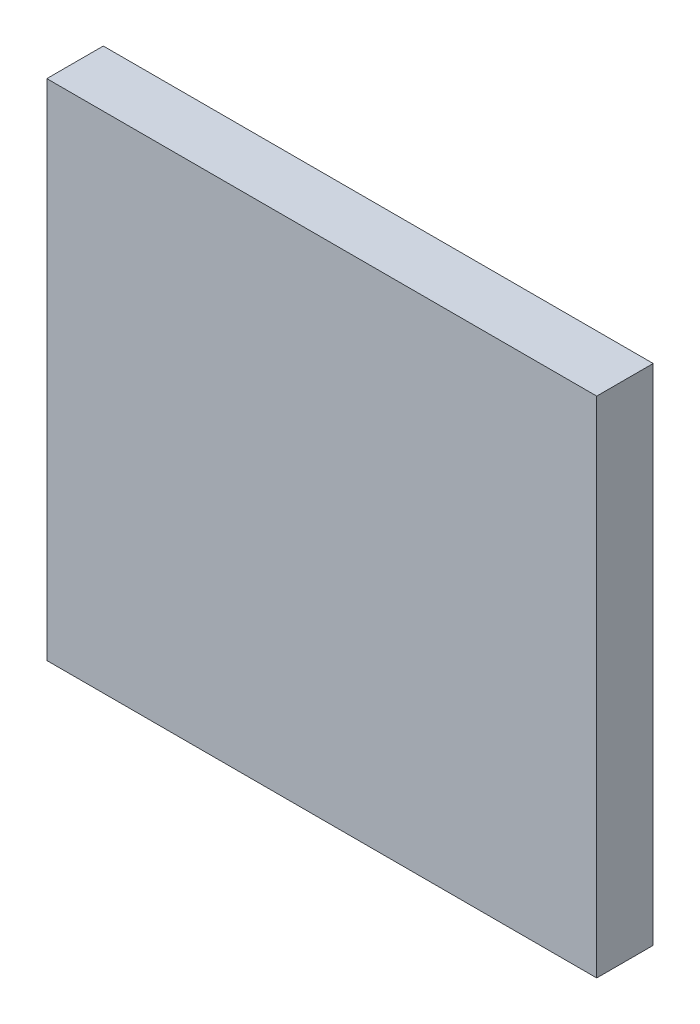
ISO-10303-21;
HEADER;
FILE_DESCRIPTION(('STEP AP214'),'2;1');
FILE_NAME('part.step','',(''),(''),'','','');
FILE_SCHEMA(('AUTOMOTIVE_DESIGN { 1 0 10303 214 1 1 1 1 }'));
ENDSEC;
DATA;
#1=APPLICATION_CONTEXT('core data for automotive mechanical design processes');
#2=APPLICATION_PROTOCOL_DEFINITION('international standard','automotive_design',2000,#1);
#3=PRODUCT_CONTEXT('',#1,'mechanical');
#4=PRODUCT('Part','Part','',(#3));
#5=PRODUCT_RELATED_PRODUCT_CATEGORY('part','',(#4));
#6=PRODUCT_DEFINITION_FORMATION('','',#4);
#7=PRODUCT_DEFINITION_CONTEXT('part definition',#1,'design');
#8=PRODUCT_DEFINITION('design','',#6,#7);
#9=PRODUCT_DEFINITION_SHAPE('','',#8);
#10=(LENGTH_UNIT() NAMED_UNIT(*) SI_UNIT(.MILLI.,.METRE.));
#11=(NAMED_UNIT(*) PLANE_ANGLE_UNIT() SI_UNIT($,.RADIAN.));
#12=(NAMED_UNIT(*) SI_UNIT($,.STERADIAN.) SOLID_ANGLE_UNIT());
#13=UNCERTAINTY_MEASURE_WITH_UNIT(LENGTH_MEASURE(1.E-05),#10,'distance_accuracy_value','');
#14=(GEOMETRIC_REPRESENTATION_CONTEXT(3) GLOBAL_UNCERTAINTY_ASSIGNED_CONTEXT((#13)) GLOBAL_UNIT_ASSIGNED_CONTEXT((#10,
#11,#12)) REPRESENTATION_CONTEXT('',''));
#15=CARTESIAN_POINT('',(0.,0.,0.));
#16=DIRECTION('',(0.,0.,1.));
#17=DIRECTION('',(1.,0.,0.));
#18=AXIS2_PLACEMENT_3D('',#15,#16,#17);
#19=CARTESIAN_POINT('',(-3.70999491999,-3.4,0.762001524003));
#20=DIRECTION('',(0.,0.,1.));
#21=DIRECTION('',(1.,0.,0.));
#22=AXIS2_PLACEMENT_3D('',#19,#20,#21);
#23=PLANE('',#22);
#24=DIRECTION('',(0.,-1.,0.));
#25=VECTOR('',#24,1.);
#26=CARTESIAN_POINT('',(3.70999491999,0.,0.762001524003));
#27=LINE('',#26,#25);
#28=CARTESIAN_POINT('',(3.70999491999,3.4,0.762001524003));
#29=VERTEX_POINT('',#28);
#30=CARTESIAN_POINT('',(3.70999491999,-3.4,0.762001524003));
#31=VERTEX_POINT('',#30);
#32=EDGE_CURVE('E77',#29,#31,#27,.T.);
#33=ORIENTED_EDGE('',*,*,#32,.F.);
#34=DIRECTION('',(1.,0.,0.));
#35=VECTOR('',#34,1.);
#36=CARTESIAN_POINT('',(0.,3.4,0.762001524003));
#37=LINE('',#36,#35);
#38=CARTESIAN_POINT('',(-3.70999491999,3.4,0.762001524003));
#39=VERTEX_POINT('',#38);
#40=EDGE_CURVE('E59',#39,#29,#37,.T.);
#41=ORIENTED_EDGE('',*,*,#40,.F.);
#42=DIRECTION('',(0.,-1.,0.));
#43=VECTOR('',#42,1.);
#44=CARTESIAN_POINT('',(-3.70999491999,0.,0.762001524003));
#45=LINE('',#44,#43);
#46=CARTESIAN_POINT('',(-3.70999491999,-3.4,0.762001524003));
#47=VERTEX_POINT('',#46);
#48=EDGE_CURVE('E21',#39,#47,#45,.T.);
#49=ORIENTED_EDGE('',*,*,#48,.T.);
#50=DIRECTION('',(1.,0.,0.));
#51=VECTOR('',#50,1.);
#52=CARTESIAN_POINT('',(0.,-3.4,0.762001524003));
#53=LINE('',#52,#51);
#54=EDGE_CURVE('E56',#47,#31,#53,.T.);
#55=ORIENTED_EDGE('',*,*,#54,.T.);
#56=EDGE_LOOP('',(#33,#41,#49,#55));
#57=FACE_BOUND('',#56,.T.);
#58=ADVANCED_FACE('F17',(#57),#23,.T.);
#59=CARTESIAN_POINT('',(-3.70999491999,3.4,0.));
#60=DIRECTION('',(1.,0.,0.));
#61=DIRECTION('',(0.,0.,1.));
#62=AXIS2_PLACEMENT_3D('',#59,#60,#61);
#63=PLANE('',#62);
#64=DIRECTION('',(0.,0.,1.));
#65=VECTOR('',#64,1.);
#66=CARTESIAN_POINT('',(-3.70999491999,3.4,0.3810007620015));
#67=LINE('',#66,#65);
#68=CARTESIAN_POINT('',(-3.70999491999,3.4,0.));
#69=VERTEX_POINT('',#68);
#70=EDGE_CURVE('E79',#69,#39,#67,.T.);
#71=ORIENTED_EDGE('',*,*,#70,.F.);
#72=DIRECTION('',(0.,-1.,0.));
#73=VECTOR('',#72,1.);
#74=CARTESIAN_POINT('',(-3.70999491999,0.,0.));
#75=LINE('',#74,#73);
#76=CARTESIAN_POINT('',(-3.70999491999,-3.4,0.));
#77=VERTEX_POINT('',#76);
#78=EDGE_CURVE('E74',#69,#77,#75,.T.);
#79=ORIENTED_EDGE('',*,*,#78,.T.);
#80=DIRECTION('',(0.,0.,1.));
#81=VECTOR('',#80,1.);
#82=CARTESIAN_POINT('',(-3.70999491999,-3.4,0.3810007620015));
#83=LINE('',#82,#81);
#84=EDGE_CURVE('E64',#77,#47,#83,.T.);
#85=ORIENTED_EDGE('',*,*,#84,.T.);
#86=ORIENTED_EDGE('',*,*,#48,.F.);
#87=EDGE_LOOP('',(#71,#79,#85,#86));
#88=FACE_BOUND('',#87,.T.);
#89=ADVANCED_FACE('F73',(#88),#63,.F.);
#90=CARTESIAN_POINT('',(-3.70999491999,-3.4,0.));
#91=DIRECTION('',(0.,1.,0.));
#92=DIRECTION('',(0.,0.,1.));
#93=AXIS2_PLACEMENT_3D('',#90,#91,#92);
#94=PLANE('',#93);
#95=ORIENTED_EDGE('',*,*,#54,.F.);
#96=ORIENTED_EDGE('',*,*,#84,.F.);
#97=DIRECTION('',(1.,0.,0.));
#98=VECTOR('',#97,1.);
#99=CARTESIAN_POINT('',(0.,-3.4,0.));
#100=LINE('',#99,#98);
#101=CARTESIAN_POINT('',(3.70999491999,-3.4,0.));
#102=VERTEX_POINT('',#101);
#103=EDGE_CURVE('E84',#77,#102,#100,.T.);
#104=ORIENTED_EDGE('',*,*,#103,.T.);
#105=DIRECTION('',(0.,0.,-1.));
#106=VECTOR('',#105,1.);
#107=CARTESIAN_POINT('',(3.70999491999,-3.4,0.3810007620015));
#108=LINE('',#107,#106);
#109=EDGE_CURVE('E70',#31,#102,#108,.T.);
#110=ORIENTED_EDGE('',*,*,#109,.F.);
#111=EDGE_LOOP('',(#95,#96,#104,#110));
#112=FACE_BOUND('',#111,.T.);
#113=ADVANCED_FACE('F67',(#112),#94,.F.);
#114=CARTESIAN_POINT('',(3.70999491999,3.4,0.));
#115=DIRECTION('',(1.,0.,0.));
#116=DIRECTION('',(0.,0.,1.));
#117=AXIS2_PLACEMENT_3D('',#114,#115,#116);
#118=PLANE('',#117);
#119=DIRECTION('',(0.,0.,-1.));
#120=VECTOR('',#119,1.);
#121=CARTESIAN_POINT('',(3.70999491999,3.4,0.3810007620015));
#122=LINE('',#121,#120);
#123=CARTESIAN_POINT('',(3.70999491999,3.4,0.));
#124=VERTEX_POINT('',#123);
#125=EDGE_CURVE('E35',#29,#124,#122,.T.);
#126=ORIENTED_EDGE('',*,*,#125,.F.);
#127=ORIENTED_EDGE('',*,*,#32,.T.);
#128=ORIENTED_EDGE('',*,*,#109,.T.);
#129=DIRECTION('',(0.,1.,0.));
#130=VECTOR('',#129,1.);
#131=CARTESIAN_POINT('',(3.70999491999,0.,0.));
#132=LINE('',#131,#130);
#133=EDGE_CURVE('E27',#102,#124,#132,.T.);
#134=ORIENTED_EDGE('',*,*,#133,.T.);
#135=EDGE_LOOP('',(#126,#127,#128,#134));
#136=FACE_BOUND('',#135,.T.);
#137=ADVANCED_FACE('F89',(#136),#118,.T.);
#138=CARTESIAN_POINT('',(-3.70999491999,3.4,0.));
#139=DIRECTION('',(0.,1.,0.));
#140=DIRECTION('',(0.,0.,1.));
#141=AXIS2_PLACEMENT_3D('',#138,#139,#140);
#142=PLANE('',#141);
#143=ORIENTED_EDGE('',*,*,#40,.T.);
#144=ORIENTED_EDGE('',*,*,#125,.T.);
#145=DIRECTION('',(-1.,0.,0.));
#146=VECTOR('',#145,1.);
#147=CARTESIAN_POINT('',(0.,3.4,0.));
#148=LINE('',#147,#146);
#149=EDGE_CURVE('E11',#124,#69,#148,.T.);
#150=ORIENTED_EDGE('',*,*,#149,.T.);
#151=ORIENTED_EDGE('',*,*,#70,.T.);
#152=EDGE_LOOP('',(#143,#144,#150,#151));
#153=FACE_BOUND('',#152,.T.);
#154=ADVANCED_FACE('F91',(#153),#142,.T.);
#155=CARTESIAN_POINT('',(-3.70999491999,-3.4,0.));
#156=DIRECTION('',(0.,0.,1.));
#157=DIRECTION('',(1.,0.,0.));
#158=AXIS2_PLACEMENT_3D('',#155,#156,#157);
#159=PLANE('',#158);
#160=ORIENTED_EDGE('',*,*,#133,.F.);
#161=ORIENTED_EDGE('',*,*,#103,.F.);
#162=ORIENTED_EDGE('',*,*,#78,.F.);
#163=ORIENTED_EDGE('',*,*,#149,.F.);
#164=EDGE_LOOP('',(#160,#161,#162,#163));
#165=FACE_BOUND('',#164,.T.);
#166=ADVANCED_FACE('F19',(#165),#159,.F.);
#167=CLOSED_SHELL('',(#58,#89,#113,#137,#154,#166));
#168=MANIFOLD_SOLID_BREP('B1',#167);
#169=ADVANCED_BREP_SHAPE_REPRESENTATION('',(#18,#168),#14);
#170=SHAPE_DEFINITION_REPRESENTATION(#9,#169);
ENDSEC;
END-ISO-10303-21;
